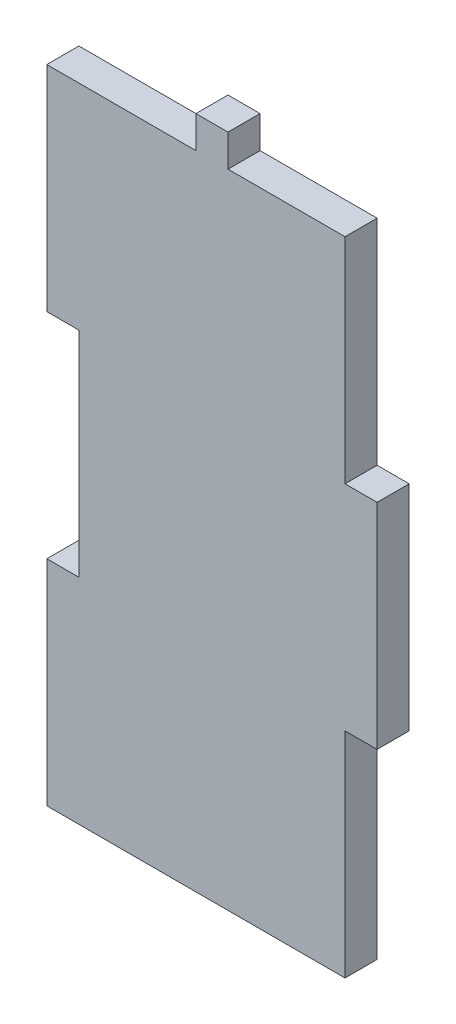
ISO-10303-21;
HEADER;
FILE_DESCRIPTION(('STEP AP214'),'2;1');
FILE_NAME('part.step','',(''),(''),'','','');
FILE_SCHEMA(('AUTOMOTIVE_DESIGN { 1 0 10303 214 1 1 1 1 }'));
ENDSEC;
DATA;
#1=APPLICATION_CONTEXT('core data for automotive mechanical design processes');
#2=APPLICATION_PROTOCOL_DEFINITION('international standard','automotive_design',2000,#1);
#3=PRODUCT_CONTEXT('',#1,'mechanical');
#4=PRODUCT('Part','Part','',(#3));
#5=PRODUCT_RELATED_PRODUCT_CATEGORY('part','',(#4));
#6=PRODUCT_DEFINITION_FORMATION('','',#4);
#7=PRODUCT_DEFINITION_CONTEXT('part definition',#1,'design');
#8=PRODUCT_DEFINITION('design','',#6,#7);
#9=PRODUCT_DEFINITION_SHAPE('','',#8);
#10=(LENGTH_UNIT() NAMED_UNIT(*) SI_UNIT(.MILLI.,.METRE.));
#11=(NAMED_UNIT(*) PLANE_ANGLE_UNIT() SI_UNIT($,.RADIAN.));
#12=(NAMED_UNIT(*) SI_UNIT($,.STERADIAN.) SOLID_ANGLE_UNIT());
#13=UNCERTAINTY_MEASURE_WITH_UNIT(LENGTH_MEASURE(1.E-05),#10,'distance_accuracy_value','');
#14=(GEOMETRIC_REPRESENTATION_CONTEXT(3) GLOBAL_UNCERTAINTY_ASSIGNED_CONTEXT((#13)) GLOBAL_UNIT_ASSIGNED_CONTEXT((#10,
#11,#12)) REPRESENTATION_CONTEXT('',''));
#15=CARTESIAN_POINT('',(0.,0.,0.));
#16=DIRECTION('',(0.,0.,1.));
#17=DIRECTION('',(1.,0.,0.));
#18=AXIS2_PLACEMENT_3D('',#15,#16,#17);
#19=CARTESIAN_POINT('',(31.57,20.,3.));
#20=DIRECTION('',(0.,1.,0.));
#21=DIRECTION('',(0.,0.,1.));
#22=AXIS2_PLACEMENT_3D('',#19,#20,#21);
#23=PLANE('',#22);
#24=DIRECTION('',(1.,0.,0.));
#25=VECTOR('',#24,1.);
#26=CARTESIAN_POINT('',(31.57,20.,0.));
#27=LINE('',#26,#25);
#28=CARTESIAN_POINT('',(28.22,20.,0.));
#29=VERTEX_POINT('',#28);
#30=CARTESIAN_POINT('',(31.22,20.,0.));
#31=VERTEX_POINT('',#30);
#32=EDGE_CURVE('E296',#29,#31,#27,.T.);
#33=ORIENTED_EDGE('',*,*,#32,.T.);
#34=DIRECTION('',(0.,0.,1.));
#35=VECTOR('',#34,1.);
#36=CARTESIAN_POINT('',(31.22,20.,-60.0010208246493));
#37=LINE('',#36,#35);
#38=CARTESIAN_POINT('',(31.22,20.,3.));
#39=VERTEX_POINT('',#38);
#40=EDGE_CURVE('E61',#31,#39,#37,.T.);
#41=ORIENTED_EDGE('',*,*,#40,.T.);
#42=DIRECTION('',(1.,0.,0.));
#43=VECTOR('',#42,1.);
#44=CARTESIAN_POINT('',(31.57,20.,3.));
#45=LINE('',#44,#43);
#46=CARTESIAN_POINT('',(28.22,20.,3.));
#47=VERTEX_POINT('',#46);
#48=EDGE_CURVE('E185',#47,#39,#45,.T.);
#49=ORIENTED_EDGE('',*,*,#48,.F.);
#50=DIRECTION('',(0.,0.,1.));
#51=VECTOR('',#50,1.);
#52=CARTESIAN_POINT('',(28.22,20.,-60.0010208246493));
#53=LINE('',#52,#51);
#54=EDGE_CURVE('E305',#29,#47,#53,.T.);
#55=ORIENTED_EDGE('',*,*,#54,.F.);
#56=EDGE_LOOP('',(#33,#41,#49,#55));
#57=FACE_BOUND('',#56,.T.);
#58=ADVANCED_FACE('F46',(#57),#23,.F.);
#59=CARTESIAN_POINT('',(28.57,40.,3.));
#60=DIRECTION('',(0.,-1.,0.));
#61=DIRECTION('',(0.,0.,-1.));
#62=AXIS2_PLACEMENT_3D('',#59,#60,#61);
#63=PLANE('',#62);
#64=DIRECTION('',(-1.,0.,0.));
#65=VECTOR('',#64,1.);
#66=CARTESIAN_POINT('',(28.57,40.,3.));
#67=LINE('',#66,#65);
#68=CARTESIAN_POINT('',(31.22,40.,3.));
#69=VERTEX_POINT('',#68);
#70=CARTESIAN_POINT('',(28.22,40.,3.));
#71=VERTEX_POINT('',#70);
#72=EDGE_CURVE('E191',#69,#71,#67,.T.);
#73=ORIENTED_EDGE('',*,*,#72,.F.);
#74=DIRECTION('',(0.,0.,1.));
#75=VECTOR('',#74,1.);
#76=CARTESIAN_POINT('',(31.22,40.,-60.0010208246493));
#77=LINE('',#76,#75);
#78=CARTESIAN_POINT('',(31.22,40.,0.));
#79=VERTEX_POINT('',#78);
#80=EDGE_CURVE('E319',#79,#69,#77,.T.);
#81=ORIENTED_EDGE('',*,*,#80,.F.);
#82=DIRECTION('',(-1.,0.,0.));
#83=VECTOR('',#82,1.);
#84=CARTESIAN_POINT('',(28.57,40.,0.));
#85=LINE('',#84,#83);
#86=CARTESIAN_POINT('',(28.22,40.,0.));
#87=VERTEX_POINT('',#86);
#88=EDGE_CURVE('E232',#79,#87,#85,.T.);
#89=ORIENTED_EDGE('',*,*,#88,.T.);
#90=DIRECTION('',(0.,0.,1.));
#91=VECTOR('',#90,1.);
#92=CARTESIAN_POINT('',(28.22,40.,-60.0010208246493));
#93=LINE('',#92,#91);
#94=EDGE_CURVE('E318',#87,#71,#93,.T.);
#95=ORIENTED_EDGE('',*,*,#94,.T.);
#96=EDGE_LOOP('',(#73,#81,#89,#95));
#97=FACE_BOUND('',#96,.T.);
#98=ADVANCED_FACE('F380',(#97),#63,.F.);
#99=CARTESIAN_POINT('',(17.285,60.,3.));
#100=DIRECTION('',(0.,-1.,0.));
#101=DIRECTION('',(0.,0.,-1.));
#102=AXIS2_PLACEMENT_3D('',#99,#100,#101);
#103=PLANE('',#102);
#104=DIRECTION('',(-1.,0.,0.));
#105=VECTOR('',#104,1.);
#106=CARTESIAN_POINT('',(17.285,60.,3.));
#107=LINE('',#106,#105);
#108=CARTESIAN_POINT('',(28.22,60.,3.));
#109=VERTEX_POINT('',#108);
#110=CARTESIAN_POINT('',(17.285,60.,3.));
#111=VERTEX_POINT('',#110);
#112=EDGE_CURVE('E330',#109,#111,#107,.T.);
#113=ORIENTED_EDGE('',*,*,#112,.F.);
#114=DIRECTION('',(0.,0.,1.));
#115=VECTOR('',#114,1.);
#116=CARTESIAN_POINT('',(28.22,60.,-60.0010208246493));
#117=LINE('',#116,#115);
#118=CARTESIAN_POINT('',(28.22,60.,0.));
#119=VERTEX_POINT('',#118);
#120=EDGE_CURVE('E274',#119,#109,#117,.T.);
#121=ORIENTED_EDGE('',*,*,#120,.F.);
#122=DIRECTION('',(-1.,0.,0.));
#123=VECTOR('',#122,1.);
#124=CARTESIAN_POINT('',(17.285,60.,0.));
#125=LINE('',#124,#123);
#126=CARTESIAN_POINT('',(17.285,60.,0.));
#127=VERTEX_POINT('',#126);
#128=EDGE_CURVE('E223',#119,#127,#125,.T.);
#129=ORIENTED_EDGE('',*,*,#128,.T.);
#130=DIRECTION('',(0.,0.,-1.));
#131=VECTOR('',#130,1.);
#132=CARTESIAN_POINT('',(17.285,60.,3.));
#133=LINE('',#132,#131);
#134=EDGE_CURVE('E54',#111,#127,#133,.T.);
#135=ORIENTED_EDGE('',*,*,#134,.F.);
#136=EDGE_LOOP('',(#113,#121,#129,#135));
#137=FACE_BOUND('',#136,.T.);
#138=ADVANCED_FACE('F388',(#137),#103,.F.);
#139=CARTESIAN_POINT('',(17.285,63.,3.));
#140=DIRECTION('',(-1.,0.,0.));
#141=DIRECTION('',(0.,0.,1.));
#142=AXIS2_PLACEMENT_3D('',#139,#140,#141);
#143=PLANE('',#142);
#144=DIRECTION('',(0.,1.,0.));
#145=VECTOR('',#144,1.);
#146=CARTESIAN_POINT('',(17.285,63.,0.));
#147=LINE('',#146,#145);
#148=CARTESIAN_POINT('',(17.285,63.,0.));
#149=VERTEX_POINT('',#148);
#150=EDGE_CURVE('E216',#127,#149,#147,.T.);
#151=ORIENTED_EDGE('',*,*,#150,.T.);
#152=DIRECTION('',(0.,0.,-1.));
#153=VECTOR('',#152,1.);
#154=CARTESIAN_POINT('',(17.285,63.,3.));
#155=LINE('',#154,#153);
#156=CARTESIAN_POINT('',(17.285,63.,3.));
#157=VERTEX_POINT('',#156);
#158=EDGE_CURVE('E205',#157,#149,#155,.T.);
#159=ORIENTED_EDGE('',*,*,#158,.F.);
#160=DIRECTION('',(0.,1.,0.));
#161=VECTOR('',#160,1.);
#162=CARTESIAN_POINT('',(17.285,63.,3.));
#163=LINE('',#162,#161);
#164=EDGE_CURVE('E217',#111,#157,#163,.T.);
#165=ORIENTED_EDGE('',*,*,#164,.F.);
#166=ORIENTED_EDGE('',*,*,#134,.T.);
#167=EDGE_LOOP('',(#151,#159,#165,#166));
#168=FACE_BOUND('',#167,.T.);
#169=ADVANCED_FACE('F214',(#168),#143,.F.);
#170=CARTESIAN_POINT('',(14.285,63.,3.));
#171=DIRECTION('',(0.,-1.,0.));
#172=DIRECTION('',(0.,0.,-1.));
#173=AXIS2_PLACEMENT_3D('',#170,#171,#172);
#174=PLANE('',#173);
#175=DIRECTION('',(-1.,0.,0.));
#176=VECTOR('',#175,1.);
#177=CARTESIAN_POINT('',(14.285,63.,0.));
#178=LINE('',#177,#176);
#179=CARTESIAN_POINT('',(14.285,63.,0.));
#180=VERTEX_POINT('',#179);
#181=EDGE_CURVE('E225',#149,#180,#178,.T.);
#182=ORIENTED_EDGE('',*,*,#181,.T.);
#183=DIRECTION('',(0.,0.,-1.));
#184=VECTOR('',#183,1.);
#185=CARTESIAN_POINT('',(14.285,63.,3.));
#186=LINE('',#185,#184);
#187=CARTESIAN_POINT('',(14.285,63.,3.));
#188=VERTEX_POINT('',#187);
#189=EDGE_CURVE('E201',#188,#180,#186,.T.);
#190=ORIENTED_EDGE('',*,*,#189,.F.);
#191=DIRECTION('',(-1.,0.,0.));
#192=VECTOR('',#191,1.);
#193=CARTESIAN_POINT('',(14.285,63.,3.));
#194=LINE('',#193,#192);
#195=EDGE_CURVE('E339',#157,#188,#194,.T.);
#196=ORIENTED_EDGE('',*,*,#195,.F.);
#197=ORIENTED_EDGE('',*,*,#158,.T.);
#198=EDGE_LOOP('',(#182,#190,#196,#197));
#199=FACE_BOUND('',#198,.T.);
#200=ADVANCED_FACE('F397',(#199),#174,.F.);
#201=CARTESIAN_POINT('',(14.285,60.,3.));
#202=DIRECTION('',(1.,0.,0.));
#203=DIRECTION('',(0.,0.,-1.));
#204=AXIS2_PLACEMENT_3D('',#201,#202,#203);
#205=PLANE('',#204);
#206=DIRECTION('',(0.,-1.,0.));
#207=VECTOR('',#206,1.);
#208=CARTESIAN_POINT('',(14.285,60.,0.));
#209=LINE('',#208,#207);
#210=CARTESIAN_POINT('',(14.285,60.,0.));
#211=VERTEX_POINT('',#210);
#212=EDGE_CURVE('E230',#180,#211,#209,.T.);
#213=ORIENTED_EDGE('',*,*,#212,.T.);
#214=DIRECTION('',(0.,0.,-1.));
#215=VECTOR('',#214,1.);
#216=CARTESIAN_POINT('',(14.285,60.,3.));
#217=LINE('',#216,#215);
#218=CARTESIAN_POINT('',(14.285,60.,3.));
#219=VERTEX_POINT('',#218);
#220=EDGE_CURVE('E197',#219,#211,#217,.T.);
#221=ORIENTED_EDGE('',*,*,#220,.F.);
#222=DIRECTION('',(0.,-1.,0.));
#223=VECTOR('',#222,1.);
#224=CARTESIAN_POINT('',(14.285,60.,3.));
#225=LINE('',#224,#223);
#226=EDGE_CURVE('E342',#188,#219,#225,.T.);
#227=ORIENTED_EDGE('',*,*,#226,.F.);
#228=ORIENTED_EDGE('',*,*,#189,.T.);
#229=EDGE_LOOP('',(#213,#221,#227,#228));
#230=FACE_BOUND('',#229,.T.);
#231=ADVANCED_FACE('F408',(#230),#205,.F.);
#232=CARTESIAN_POINT('',(0.,60.,3.));
#233=DIRECTION('',(0.,-1.,0.));
#234=DIRECTION('',(0.,0.,-1.));
#235=AXIS2_PLACEMENT_3D('',#232,#233,#234);
#236=PLANE('',#235);
#237=DIRECTION('',(-1.,0.,0.));
#238=VECTOR('',#237,1.);
#239=CARTESIAN_POINT('',(0.,60.,0.));
#240=LINE('',#239,#238);
#241=CARTESIAN_POINT('',(0.35,60.,0.));
#242=VERTEX_POINT('',#241);
#243=EDGE_CURVE('E238',#211,#242,#240,.T.);
#244=ORIENTED_EDGE('',*,*,#243,.T.);
#245=DIRECTION('',(0.,0.,1.));
#246=VECTOR('',#245,1.);
#247=CARTESIAN_POINT('',(0.35,60.,-60.0010208246493));
#248=LINE('',#247,#246);
#249=CARTESIAN_POINT('',(0.35,60.,3.));
#250=VERTEX_POINT('',#249);
#251=EDGE_CURVE('E68',#242,#250,#248,.T.);
#252=ORIENTED_EDGE('',*,*,#251,.T.);
#253=DIRECTION('',(-1.,0.,0.));
#254=VECTOR('',#253,1.);
#255=CARTESIAN_POINT('',(0.,60.,3.));
#256=LINE('',#255,#254);
#257=EDGE_CURVE('E345',#219,#250,#256,.T.);
#258=ORIENTED_EDGE('',*,*,#257,.F.);
#259=ORIENTED_EDGE('',*,*,#220,.T.);
#260=EDGE_LOOP('',(#244,#252,#258,#259));
#261=FACE_BOUND('',#260,.T.);
#262=ADVANCED_FACE('F426',(#261),#236,.F.);
#263=CARTESIAN_POINT('',(3.,40.,3.));
#264=DIRECTION('',(0.,1.,0.));
#265=DIRECTION('',(0.,0.,1.));
#266=AXIS2_PLACEMENT_3D('',#263,#264,#265);
#267=PLANE('',#266);
#268=DIRECTION('',(1.,0.,0.));
#269=VECTOR('',#268,1.);
#270=CARTESIAN_POINT('',(3.,40.,3.));
#271=LINE('',#270,#269);
#272=CARTESIAN_POINT('',(0.350000000000002,40.,3.));
#273=VERTEX_POINT('',#272);
#274=CARTESIAN_POINT('',(3.35,40.,3.));
#275=VERTEX_POINT('',#274);
#276=EDGE_CURVE('E290',#273,#275,#271,.T.);
#277=ORIENTED_EDGE('',*,*,#276,.F.);
#278=DIRECTION('',(0.,0.,-1.));
#279=VECTOR('',#278,1.);
#280=CARTESIAN_POINT('',(0.350000000000003,40.,3.));
#281=LINE('',#280,#279);
#282=CARTESIAN_POINT('',(0.350000000000002,40.,0.));
#283=VERTEX_POINT('',#282);
#284=EDGE_CURVE('E251',#273,#283,#281,.T.);
#285=ORIENTED_EDGE('',*,*,#284,.T.);
#286=DIRECTION('',(1.,0.,0.));
#287=VECTOR('',#286,1.);
#288=CARTESIAN_POINT('',(3.,40.,0.));
#289=LINE('',#288,#287);
#290=CARTESIAN_POINT('',(3.35,40.,0.));
#291=VERTEX_POINT('',#290);
#292=EDGE_CURVE('E193',#283,#291,#289,.T.);
#293=ORIENTED_EDGE('',*,*,#292,.T.);
#294=DIRECTION('',(0.,0.,1.));
#295=VECTOR('',#294,1.);
#296=CARTESIAN_POINT('',(3.35,40.,-60.0010208246493));
#297=LINE('',#296,#295);
#298=EDGE_CURVE('E249',#291,#275,#297,.T.);
#299=ORIENTED_EDGE('',*,*,#298,.T.);
#300=EDGE_LOOP('',(#277,#285,#293,#299));
#301=FACE_BOUND('',#300,.T.);
#302=ADVANCED_FACE('F248',(#301),#267,.F.);
#303=CARTESIAN_POINT('',(0.,20.,3.));
#304=DIRECTION('',(0.,-1.,0.));
#305=DIRECTION('',(0.,0.,-1.));
#306=AXIS2_PLACEMENT_3D('',#303,#304,#305);
#307=PLANE('',#306);
#308=DIRECTION('',(-1.,0.,0.));
#309=VECTOR('',#308,1.);
#310=CARTESIAN_POINT('',(0.,20.,0.));
#311=LINE('',#310,#309);
#312=CARTESIAN_POINT('',(3.35,20.,0.));
#313=VERTEX_POINT('',#312);
#314=CARTESIAN_POINT('',(0.350000000000004,20.,0.));
#315=VERTEX_POINT('',#314);
#316=EDGE_CURVE('E186',#313,#315,#311,.T.);
#317=ORIENTED_EDGE('',*,*,#316,.T.);
#318=DIRECTION('',(0.,0.,1.));
#319=VECTOR('',#318,1.);
#320=CARTESIAN_POINT('',(0.350000000000005,20.,3.));
#321=LINE('',#320,#319);
#322=CARTESIAN_POINT('',(0.350000000000005,20.,3.));
#323=VERTEX_POINT('',#322);
#324=EDGE_CURVE('E163',#315,#323,#321,.T.);
#325=ORIENTED_EDGE('',*,*,#324,.T.);
#326=DIRECTION('',(-1.,0.,0.));
#327=VECTOR('',#326,1.);
#328=CARTESIAN_POINT('',(0.,20.,3.));
#329=LINE('',#328,#327);
#330=CARTESIAN_POINT('',(3.35,20.,3.));
#331=VERTEX_POINT('',#330);
#332=EDGE_CURVE('E285',#331,#323,#329,.T.);
#333=ORIENTED_EDGE('',*,*,#332,.F.);
#334=DIRECTION('',(0.,0.,1.));
#335=VECTOR('',#334,1.);
#336=CARTESIAN_POINT('',(3.35,20.,-60.0010208246493));
#337=LINE('',#336,#335);
#338=EDGE_CURVE('E265',#313,#331,#337,.T.);
#339=ORIENTED_EDGE('',*,*,#338,.F.);
#340=EDGE_LOOP('',(#317,#325,#333,#339));
#341=FACE_BOUND('',#340,.T.);
#342=ADVANCED_FACE('F425',(#341),#307,.F.);
#343=CARTESIAN_POINT('',(28.57,0.,3.));
#344=DIRECTION('',(0.,1.,0.));
#345=DIRECTION('',(0.,0.,1.));
#346=AXIS2_PLACEMENT_3D('',#343,#344,#345);
#347=PLANE('',#346);
#348=DIRECTION('',(1.,0.,0.));
#349=VECTOR('',#348,1.);
#350=CARTESIAN_POINT('',(28.57,0.,3.));
#351=LINE('',#350,#349);
#352=CARTESIAN_POINT('',(0.350000000000007,0.,3.));
#353=VERTEX_POINT('',#352);
#354=CARTESIAN_POINT('',(28.22,0.,3.));
#355=VERTEX_POINT('',#354);
#356=EDGE_CURVE('E176',#353,#355,#351,.T.);
#357=ORIENTED_EDGE('',*,*,#356,.F.);
#358=DIRECTION('',(0.,0.,1.));
#359=VECTOR('',#358,1.);
#360=CARTESIAN_POINT('',(0.350000000000007,0.,-60.0010208246493));
#361=LINE('',#360,#359);
#362=CARTESIAN_POINT('',(0.350000000000007,0.,0.));
#363=VERTEX_POINT('',#362);
#364=EDGE_CURVE('E160',#363,#353,#361,.T.);
#365=ORIENTED_EDGE('',*,*,#364,.F.);
#366=DIRECTION('',(1.,0.,0.));
#367=VECTOR('',#366,1.);
#368=CARTESIAN_POINT('',(28.57,0.,0.));
#369=LINE('',#368,#367);
#370=CARTESIAN_POINT('',(28.22,0.,0.));
#371=VERTEX_POINT('',#370);
#372=EDGE_CURVE('E174',#363,#371,#369,.T.);
#373=ORIENTED_EDGE('',*,*,#372,.T.);
#374=DIRECTION('',(0.,0.,1.));
#375=VECTOR('',#374,1.);
#376=CARTESIAN_POINT('',(28.22,0.,-60.0010208246493));
#377=LINE('',#376,#375);
#378=EDGE_CURVE('E308',#371,#355,#377,.T.);
#379=ORIENTED_EDGE('',*,*,#378,.T.);
#380=EDGE_LOOP('',(#357,#365,#373,#379));
#381=FACE_BOUND('',#380,.T.);
#382=ADVANCED_FACE('F172',(#381),#347,.F.);
#383=CARTESIAN_POINT('',(0.,0.,3.));
#384=DIRECTION('',(0.,0.,-1.));
#385=DIRECTION('',(-1.,0.,0.));
#386=AXIS2_PLACEMENT_3D('',#383,#384,#385);
#387=PLANE('',#386);
#388=ORIENTED_EDGE('',*,*,#257,.T.);
#389=DIRECTION('',(0.,1.,0.));
#390=VECTOR('',#389,1.);
#391=CARTESIAN_POINT('',(0.35,60.,3.));
#392=LINE('',#391,#390);
#393=EDGE_CURVE('E273',#273,#250,#392,.T.);
#394=ORIENTED_EDGE('',*,*,#393,.F.);
#395=ORIENTED_EDGE('',*,*,#276,.T.);
#396=DIRECTION('',(0.,1.,0.));
#397=VECTOR('',#396,1.);
#398=CARTESIAN_POINT('',(3.35,40.,3.));
#399=LINE('',#398,#397);
#400=EDGE_CURVE('E260',#331,#275,#399,.T.);
#401=ORIENTED_EDGE('',*,*,#400,.F.);
#402=ORIENTED_EDGE('',*,*,#332,.T.);
#403=EDGE_CURVE('E178',#353,#323,#392,.T.);
#404=ORIENTED_EDGE('',*,*,#403,.F.);
#405=ORIENTED_EDGE('',*,*,#356,.T.);
#406=DIRECTION('',(0.,-1.,0.));
#407=VECTOR('',#406,1.);
#408=CARTESIAN_POINT('',(28.22,20.,3.));
#409=LINE('',#408,#407);
#410=EDGE_CURVE('E301',#47,#355,#409,.T.);
#411=ORIENTED_EDGE('',*,*,#410,.F.);
#412=ORIENTED_EDGE('',*,*,#48,.T.);
#413=DIRECTION('',(0.,-1.,0.));
#414=VECTOR('',#413,1.);
#415=CARTESIAN_POINT('',(31.22,40.,3.));
#416=LINE('',#415,#414);
#417=EDGE_CURVE('E314',#69,#39,#416,.T.);
#418=ORIENTED_EDGE('',*,*,#417,.F.);
#419=ORIENTED_EDGE('',*,*,#72,.T.);
#420=DIRECTION('',(0.,-1.,0.));
#421=VECTOR('',#420,1.);
#422=CARTESIAN_POINT('',(28.22,60.,3.));
#423=LINE('',#422,#421);
#424=EDGE_CURVE('E262',#109,#71,#423,.T.);
#425=ORIENTED_EDGE('',*,*,#424,.F.);
#426=ORIENTED_EDGE('',*,*,#112,.T.);
#427=ORIENTED_EDGE('',*,*,#164,.T.);
#428=ORIENTED_EDGE('',*,*,#195,.T.);
#429=ORIENTED_EDGE('',*,*,#226,.T.);
#430=EDGE_LOOP('',(#388,#394,#395,#401,#402,#404,#405,#411,#412,#418,#419,#425,#426,#427,#428,#429));
#431=FACE_BOUND('',#430,.T.);
#432=ADVANCED_FACE('F386',(#431),#387,.F.);
#433=CARTESIAN_POINT('',(0.,0.,0.));
#434=DIRECTION('',(0.,0.,-1.));
#435=DIRECTION('',(-1.,0.,0.));
#436=AXIS2_PLACEMENT_3D('',#433,#434,#435);
#437=PLANE('',#436);
#438=DIRECTION('',(0.,-1.,0.));
#439=VECTOR('',#438,1.);
#440=CARTESIAN_POINT('',(0.350000000000007,0.,0.));
#441=LINE('',#440,#439);
#442=EDGE_CURVE('E12',#242,#283,#441,.T.);
#443=ORIENTED_EDGE('',*,*,#442,.F.);
#444=ORIENTED_EDGE('',*,*,#243,.F.);
#445=ORIENTED_EDGE('',*,*,#212,.F.);
#446=ORIENTED_EDGE('',*,*,#181,.F.);
#447=ORIENTED_EDGE('',*,*,#150,.F.);
#448=ORIENTED_EDGE('',*,*,#128,.F.);
#449=DIRECTION('',(0.,-1.,0.));
#450=VECTOR('',#449,1.);
#451=CARTESIAN_POINT('',(28.22,60.,0.));
#452=LINE('',#451,#450);
#453=EDGE_CURVE('E373',#119,#87,#452,.T.);
#454=ORIENTED_EDGE('',*,*,#453,.T.);
#455=ORIENTED_EDGE('',*,*,#88,.F.);
#456=DIRECTION('',(0.,-1.,0.));
#457=VECTOR('',#456,1.);
#458=CARTESIAN_POINT('',(31.22,40.,0.));
#459=LINE('',#458,#457);
#460=EDGE_CURVE('E320',#79,#31,#459,.T.);
#461=ORIENTED_EDGE('',*,*,#460,.T.);
#462=ORIENTED_EDGE('',*,*,#32,.F.);
#463=DIRECTION('',(0.,-1.,0.));
#464=VECTOR('',#463,1.);
#465=CARTESIAN_POINT('',(28.22,20.,0.));
#466=LINE('',#465,#464);
#467=EDGE_CURVE('E183',#29,#371,#466,.T.);
#468=ORIENTED_EDGE('',*,*,#467,.T.);
#469=ORIENTED_EDGE('',*,*,#372,.F.);
#470=DIRECTION('',(0.,1.,0.));
#471=VECTOR('',#470,1.);
#472=CARTESIAN_POINT('',(0.35,60.,0.));
#473=LINE('',#472,#471);
#474=EDGE_CURVE('E157',#363,#315,#473,.T.);
#475=ORIENTED_EDGE('',*,*,#474,.T.);
#476=ORIENTED_EDGE('',*,*,#316,.F.);
#477=DIRECTION('',(0.,1.,0.));
#478=VECTOR('',#477,1.);
#479=CARTESIAN_POINT('',(3.35,40.,0.));
#480=LINE('',#479,#478);
#481=EDGE_CURVE('E257',#313,#291,#480,.T.);
#482=ORIENTED_EDGE('',*,*,#481,.T.);
#483=ORIENTED_EDGE('',*,*,#292,.F.);
#484=EDGE_LOOP('',(#443,#444,#445,#446,#447,#448,#454,#455,#461,#462,#468,#469,#475,#476,#482,#483));
#485=FACE_BOUND('',#484,.T.);
#486=ADVANCED_FACE('F181',(#485),#437,.T.);
#487=CARTESIAN_POINT('',(3.35,40.,-60.0010208246493));
#488=DIRECTION('',(1.,0.,0.));
#489=DIRECTION('',(0.,1.,0.));
#490=AXIS2_PLACEMENT_3D('',#487,#488,#489);
#491=PLANE('',#490);
#492=ORIENTED_EDGE('',*,*,#338,.T.);
#493=ORIENTED_EDGE('',*,*,#400,.T.);
#494=ORIENTED_EDGE('',*,*,#298,.F.);
#495=ORIENTED_EDGE('',*,*,#481,.F.);
#496=EDGE_LOOP('',(#492,#493,#494,#495));
#497=FACE_BOUND('',#496,.T.);
#498=ADVANCED_FACE('F256',(#497),#491,.F.);
#499=CARTESIAN_POINT('',(28.22,60.,-60.0010208246493));
#500=DIRECTION('',(-1.,0.,0.));
#501=DIRECTION('',(0.,0.,1.));
#502=AXIS2_PLACEMENT_3D('',#499,#500,#501);
#503=PLANE('',#502);
#504=ORIENTED_EDGE('',*,*,#120,.T.);
#505=ORIENTED_EDGE('',*,*,#424,.T.);
#506=ORIENTED_EDGE('',*,*,#94,.F.);
#507=ORIENTED_EDGE('',*,*,#453,.F.);
#508=EDGE_LOOP('',(#504,#505,#506,#507));
#509=FACE_BOUND('',#508,.T.);
#510=ADVANCED_FACE('F383',(#509),#503,.F.);
#511=CARTESIAN_POINT('',(31.22,40.,-60.0010208246493));
#512=DIRECTION('',(-1.,0.,0.));
#513=DIRECTION('',(0.,-1.,0.));
#514=AXIS2_PLACEMENT_3D('',#511,#512,#513);
#515=PLANE('',#514);
#516=ORIENTED_EDGE('',*,*,#80,.T.);
#517=ORIENTED_EDGE('',*,*,#417,.T.);
#518=ORIENTED_EDGE('',*,*,#40,.F.);
#519=ORIENTED_EDGE('',*,*,#460,.F.);
#520=EDGE_LOOP('',(#516,#517,#518,#519));
#521=FACE_BOUND('',#520,.T.);
#522=ADVANCED_FACE('F461',(#521),#515,.F.);
#523=CARTESIAN_POINT('',(28.22,20.,-60.0010208246493));
#524=DIRECTION('',(-1.,0.,0.));
#525=DIRECTION('',(0.,-1.,0.));
#526=AXIS2_PLACEMENT_3D('',#523,#524,#525);
#527=PLANE('',#526);
#528=ORIENTED_EDGE('',*,*,#54,.T.);
#529=ORIENTED_EDGE('',*,*,#410,.T.);
#530=ORIENTED_EDGE('',*,*,#378,.F.);
#531=ORIENTED_EDGE('',*,*,#467,.F.);
#532=EDGE_LOOP('',(#528,#529,#530,#531));
#533=FACE_BOUND('',#532,.T.);
#534=ADVANCED_FACE('F470',(#533),#527,.F.);
#535=CARTESIAN_POINT('',(0.35,60.,-60.0010208246493));
#536=DIRECTION('',(1.,0.,0.));
#537=DIRECTION('',(0.,1.,0.));
#538=AXIS2_PLACEMENT_3D('',#535,#536,#537);
#539=PLANE('',#538);
#540=ORIENTED_EDGE('',*,*,#474,.F.);
#541=ORIENTED_EDGE('',*,*,#364,.T.);
#542=ORIENTED_EDGE('',*,*,#403,.T.);
#543=ORIENTED_EDGE('',*,*,#324,.F.);
#544=EDGE_LOOP('',(#540,#541,#542,#543));
#545=FACE_BOUND('',#544,.T.);
#546=ADVANCED_FACE('F159',(#545),#539,.F.);
#547=ORIENTED_EDGE('',*,*,#393,.T.);
#548=ORIENTED_EDGE('',*,*,#251,.F.);
#549=ORIENTED_EDGE('',*,*,#442,.T.);
#550=ORIENTED_EDGE('',*,*,#284,.F.);
#551=EDGE_LOOP('',(#547,#548,#549,#550));
#552=FACE_BOUND('',#551,.T.);
#553=ADVANCED_FACE('F488',(#552),#539,.F.);
#554=CLOSED_SHELL('',(#58,#98,#138,#169,#200,#231,#262,#302,#342,#382,#432,#486,#498,#510,#522,
#534,#546,#553));
#555=MANIFOLD_SOLID_BREP('B2',#554);
#556=ADVANCED_BREP_SHAPE_REPRESENTATION('',(#18,#555),#14);
#557=SHAPE_DEFINITION_REPRESENTATION(#9,#556);
ENDSEC;
END-ISO-10303-21;
